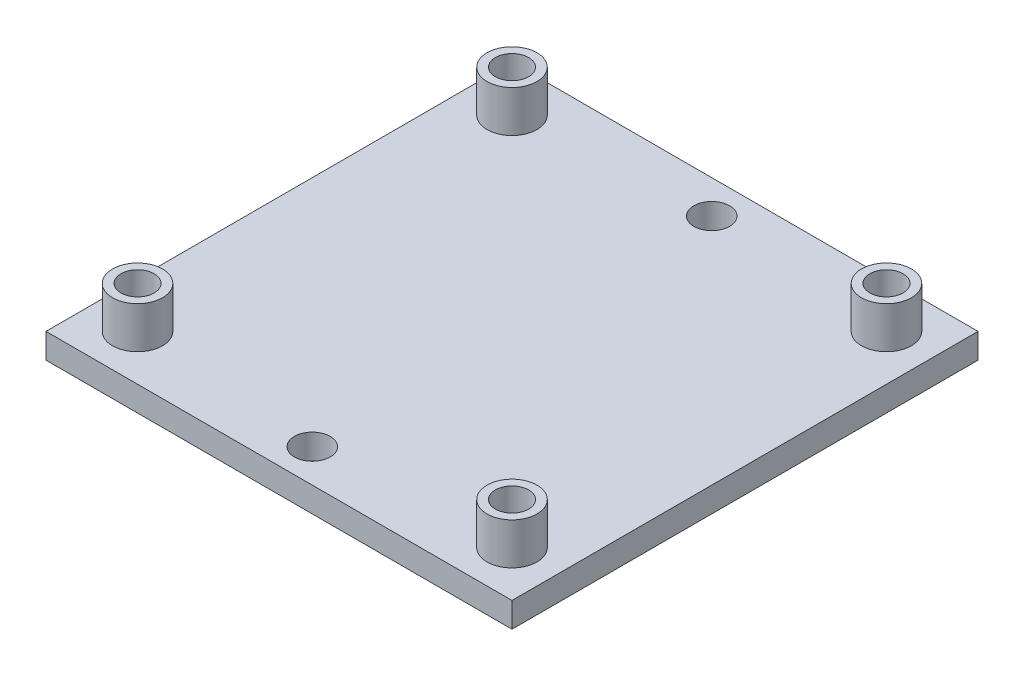
ISO-10303-21;
HEADER;
FILE_DESCRIPTION(('STEP AP214'),'2;1');
FILE_NAME('part.step','',(''),(''),'','','');
FILE_SCHEMA(('AUTOMOTIVE_DESIGN { 1 0 10303 214 1 1 1 1 }'));
ENDSEC;
DATA;
#1=APPLICATION_CONTEXT('core data for automotive mechanical design processes');
#2=APPLICATION_PROTOCOL_DEFINITION('international standard','automotive_design',2000,#1);
#3=PRODUCT_CONTEXT('',#1,'mechanical');
#4=PRODUCT('Part','Part','',(#3));
#5=PRODUCT_RELATED_PRODUCT_CATEGORY('part','',(#4));
#6=PRODUCT_DEFINITION_FORMATION('','',#4);
#7=PRODUCT_DEFINITION_CONTEXT('part definition',#1,'design');
#8=PRODUCT_DEFINITION('design','',#6,#7);
#9=PRODUCT_DEFINITION_SHAPE('','',#8);
#10=(LENGTH_UNIT() NAMED_UNIT(*) SI_UNIT(.MILLI.,.METRE.));
#11=(NAMED_UNIT(*) PLANE_ANGLE_UNIT() SI_UNIT($,.RADIAN.));
#12=(NAMED_UNIT(*) SI_UNIT($,.STERADIAN.) SOLID_ANGLE_UNIT());
#13=UNCERTAINTY_MEASURE_WITH_UNIT(LENGTH_MEASURE(1.E-05),#10,'distance_accuracy_value','');
#14=(GEOMETRIC_REPRESENTATION_CONTEXT(3) GLOBAL_UNCERTAINTY_ASSIGNED_CONTEXT((#13)) GLOBAL_UNIT_ASSIGNED_CONTEXT((#10,
#11,#12)) REPRESENTATION_CONTEXT('',''));
#15=CARTESIAN_POINT('',(0.,0.,0.));
#16=DIRECTION('',(0.,0.,1.));
#17=DIRECTION('',(1.,0.,0.));
#18=AXIS2_PLACEMENT_3D('',#15,#16,#17);
#19=CARTESIAN_POINT('',(-28.,3.,-28.));
#20=DIRECTION('',(1.,0.,0.));
#21=DIRECTION('',(0.,0.,-1.));
#22=AXIS2_PLACEMENT_3D('',#19,#20,#21);
#23=PLANE('',#22);
#24=DIRECTION('',(0.,0.,1.));
#25=VECTOR('',#24,1.);
#26=CARTESIAN_POINT('',(-28.,0.,-28.));
#27=LINE('',#26,#25);
#28=CARTESIAN_POINT('',(-28.,0.,-28.));
#29=VERTEX_POINT('',#28);
#30=CARTESIAN_POINT('',(-28.,0.,28.));
#31=VERTEX_POINT('',#30);
#32=EDGE_CURVE('E106',#29,#31,#27,.T.);
#33=ORIENTED_EDGE('',*,*,#32,.T.);
#34=DIRECTION('',(0.,-1.,0.));
#35=VECTOR('',#34,1.);
#36=CARTESIAN_POINT('',(-28.,3.,28.));
#37=LINE('',#36,#35);
#38=CARTESIAN_POINT('',(-28.,3.,28.));
#39=VERTEX_POINT('',#38);
#40=EDGE_CURVE('E45',#39,#31,#37,.T.);
#41=ORIENTED_EDGE('',*,*,#40,.F.);
#42=DIRECTION('',(0.,0.,1.));
#43=VECTOR('',#42,1.);
#44=CARTESIAN_POINT('',(-28.,3.,-28.));
#45=LINE('',#44,#43);
#46=CARTESIAN_POINT('',(-28.,3.,-28.));
#47=VERTEX_POINT('',#46);
#48=EDGE_CURVE('E91',#47,#39,#45,.T.);
#49=ORIENTED_EDGE('',*,*,#48,.F.);
#50=DIRECTION('',(0.,-1.,0.));
#51=VECTOR('',#50,1.);
#52=CARTESIAN_POINT('',(-28.,3.,-28.));
#53=LINE('',#52,#51);
#54=EDGE_CURVE('E105',#47,#29,#53,.T.);
#55=ORIENTED_EDGE('',*,*,#54,.T.);
#56=EDGE_LOOP('',(#33,#41,#49,#55));
#57=FACE_BOUND('',#56,.T.);
#58=ADVANCED_FACE('F39',(#57),#23,.F.);
#59=CARTESIAN_POINT('',(-28.,3.,28.));
#60=DIRECTION('',(0.,0.,-1.));
#61=DIRECTION('',(-1.,0.,0.));
#62=AXIS2_PLACEMENT_3D('',#59,#60,#61);
#63=PLANE('',#62);
#64=DIRECTION('',(1.,0.,0.));
#65=VECTOR('',#64,1.);
#66=CARTESIAN_POINT('',(-28.,0.,28.));
#67=LINE('',#66,#65);
#68=CARTESIAN_POINT('',(28.,0.,28.));
#69=VERTEX_POINT('',#68);
#70=EDGE_CURVE('E96',#31,#69,#67,.T.);
#71=ORIENTED_EDGE('',*,*,#70,.T.);
#72=DIRECTION('',(0.,-1.,0.));
#73=VECTOR('',#72,1.);
#74=CARTESIAN_POINT('',(28.,3.,28.));
#75=LINE('',#74,#73);
#76=CARTESIAN_POINT('',(28.,3.,28.));
#77=VERTEX_POINT('',#76);
#78=EDGE_CURVE('E98',#77,#69,#75,.T.);
#79=ORIENTED_EDGE('',*,*,#78,.F.);
#80=DIRECTION('',(1.,0.,0.));
#81=VECTOR('',#80,1.);
#82=CARTESIAN_POINT('',(-28.,3.,28.));
#83=LINE('',#82,#81);
#84=EDGE_CURVE('E87',#39,#77,#83,.T.);
#85=ORIENTED_EDGE('',*,*,#84,.F.);
#86=ORIENTED_EDGE('',*,*,#40,.T.);
#87=EDGE_LOOP('',(#71,#79,#85,#86));
#88=FACE_BOUND('',#87,.T.);
#89=ADVANCED_FACE('F97',(#88),#63,.F.);
#90=CARTESIAN_POINT('',(28.,3.,-28.));
#91=DIRECTION('',(-1.,0.,0.));
#92=DIRECTION('',(0.,0.,1.));
#93=AXIS2_PLACEMENT_3D('',#90,#91,#92);
#94=PLANE('',#93);
#95=DIRECTION('',(0.,0.,-1.));
#96=VECTOR('',#95,1.);
#97=CARTESIAN_POINT('',(28.,0.,-28.));
#98=LINE('',#97,#96);
#99=CARTESIAN_POINT('',(28.,0.,-28.));
#100=VERTEX_POINT('',#99);
#101=EDGE_CURVE('E74',#69,#100,#98,.T.);
#102=ORIENTED_EDGE('',*,*,#101,.T.);
#103=DIRECTION('',(0.,-1.,0.));
#104=VECTOR('',#103,1.);
#105=CARTESIAN_POINT('',(28.,3.,-28.));
#106=LINE('',#105,#104);
#107=CARTESIAN_POINT('',(28.,3.,-28.));
#108=VERTEX_POINT('',#107);
#109=EDGE_CURVE('E100',#108,#100,#106,.T.);
#110=ORIENTED_EDGE('',*,*,#109,.F.);
#111=DIRECTION('',(0.,0.,-1.));
#112=VECTOR('',#111,1.);
#113=CARTESIAN_POINT('',(28.,3.,-28.));
#114=LINE('',#113,#112);
#115=EDGE_CURVE('E93',#77,#108,#114,.T.);
#116=ORIENTED_EDGE('',*,*,#115,.F.);
#117=ORIENTED_EDGE('',*,*,#78,.T.);
#118=EDGE_LOOP('',(#102,#110,#116,#117));
#119=FACE_BOUND('',#118,.T.);
#120=ADVANCED_FACE('F99',(#119),#94,.F.);
#121=CARTESIAN_POINT('',(-28.,3.,-28.));
#122=DIRECTION('',(0.,0.,1.));
#123=DIRECTION('',(1.,0.,0.));
#124=AXIS2_PLACEMENT_3D('',#121,#122,#123);
#125=PLANE('',#124);
#126=DIRECTION('',(-1.,0.,0.));
#127=VECTOR('',#126,1.);
#128=CARTESIAN_POINT('',(-28.,0.,-28.));
#129=LINE('',#128,#127);
#130=EDGE_CURVE('E78',#100,#29,#129,.T.);
#131=ORIENTED_EDGE('',*,*,#130,.T.);
#132=ORIENTED_EDGE('',*,*,#54,.F.);
#133=DIRECTION('',(-1.,0.,0.));
#134=VECTOR('',#133,1.);
#135=CARTESIAN_POINT('',(-28.,3.,-28.));
#136=LINE('',#135,#134);
#137=EDGE_CURVE('E60',#108,#47,#136,.T.);
#138=ORIENTED_EDGE('',*,*,#137,.F.);
#139=ORIENTED_EDGE('',*,*,#109,.T.);
#140=EDGE_LOOP('',(#131,#132,#138,#139));
#141=FACE_BOUND('',#140,.T.);
#142=ADVANCED_FACE('F112',(#141),#125,.F.);
#143=CARTESIAN_POINT('',(0.,3.,0.));
#144=DIRECTION('',(0.,1.,0.));
#145=DIRECTION('',(0.,0.,1.));
#146=AXIS2_PLACEMENT_3D('',#143,#144,#145);
#147=PLANE('',#146);
#148=CARTESIAN_POINT('',(0.,3.,24.));
#149=DIRECTION('',(0.,1.,0.));
#150=DIRECTION('',(0.,0.,1.));
#151=AXIS2_PLACEMENT_3D('',#148,#149,#150);
#152=CIRCLE('',#151,2.15);
#153=CARTESIAN_POINT('',(0.,3.,26.15));
#154=VERTEX_POINT('',#153);
#155=EDGE_CURVE('E163',#154,#154,#152,.T.);
#156=ORIENTED_EDGE('',*,*,#155,.F.);
#157=EDGE_LOOP('',(#156));
#158=FACE_BOUND('',#157,.T.);
#159=CARTESIAN_POINT('',(0.,3.,-24.));
#160=DIRECTION('',(0.,1.,0.));
#161=DIRECTION('',(0.,0.,1.));
#162=AXIS2_PLACEMENT_3D('',#159,#160,#161);
#163=CIRCLE('',#162,2.15);
#164=CARTESIAN_POINT('',(0.,3.,-21.85));
#165=VERTEX_POINT('',#164);
#166=EDGE_CURVE('E165',#165,#165,#163,.T.);
#167=ORIENTED_EDGE('',*,*,#166,.F.);
#168=EDGE_LOOP('',(#167));
#169=FACE_BOUND('',#168,.T.);
#170=CARTESIAN_POINT('',(-22.5,3.,22.5));
#171=DIRECTION('',(0.,1.,0.));
#172=DIRECTION('',(0.,0.,1.));
#173=AXIS2_PLACEMENT_3D('',#170,#171,#172);
#174=CIRCLE('',#173,3.);
#175=CARTESIAN_POINT('',(-22.5,3.,25.5));
#176=VERTEX_POINT('',#175);
#177=EDGE_CURVE('E11',#176,#176,#174,.T.);
#178=ORIENTED_EDGE('',*,*,#177,.F.);
#179=EDGE_LOOP('',(#178));
#180=FACE_BOUND('',#179,.T.);
#181=CARTESIAN_POINT('',(22.5,3.,-22.5));
#182=DIRECTION('',(0.,1.,0.));
#183=DIRECTION('',(0.,0.,1.));
#184=AXIS2_PLACEMENT_3D('',#181,#182,#183);
#185=CIRCLE('',#184,3.);
#186=CARTESIAN_POINT('',(22.5,3.,-19.5));
#187=VERTEX_POINT('',#186);
#188=EDGE_CURVE('E48',#187,#187,#185,.T.);
#189=ORIENTED_EDGE('',*,*,#188,.F.);
#190=EDGE_LOOP('',(#189));
#191=FACE_BOUND('',#190,.T.);
#192=CARTESIAN_POINT('',(-22.5,3.,-22.5));
#193=DIRECTION('',(0.,1.,0.));
#194=DIRECTION('',(0.,0.,1.));
#195=AXIS2_PLACEMENT_3D('',#192,#193,#194);
#196=CIRCLE('',#195,3.);
#197=CARTESIAN_POINT('',(-22.5,3.,-19.5));
#198=VERTEX_POINT('',#197);
#199=EDGE_CURVE('E124',#198,#198,#196,.T.);
#200=ORIENTED_EDGE('',*,*,#199,.F.);
#201=EDGE_LOOP('',(#200));
#202=FACE_BOUND('',#201,.T.);
#203=CARTESIAN_POINT('',(22.5,3.,22.5));
#204=DIRECTION('',(0.,1.,0.));
#205=DIRECTION('',(0.,0.,1.));
#206=AXIS2_PLACEMENT_3D('',#203,#204,#205);
#207=CIRCLE('',#206,3.);
#208=CARTESIAN_POINT('',(22.5,3.,25.5));
#209=VERTEX_POINT('',#208);
#210=EDGE_CURVE('E119',#209,#209,#207,.T.);
#211=ORIENTED_EDGE('',*,*,#210,.F.);
#212=EDGE_LOOP('',(#211));
#213=FACE_BOUND('',#212,.T.);
#214=ORIENTED_EDGE('',*,*,#48,.T.);
#215=ORIENTED_EDGE('',*,*,#84,.T.);
#216=ORIENTED_EDGE('',*,*,#115,.T.);
#217=ORIENTED_EDGE('',*,*,#137,.T.);
#218=EDGE_LOOP('',(#214,#215,#216,#217));
#219=FACE_BOUND('',#218,.T.);
#220=ADVANCED_FACE('F88',(#158,#169,#180,#191,#202,#213,#219),#147,.T.);
#221=CARTESIAN_POINT('',(0.,0.,0.));
#222=DIRECTION('',(0.,1.,0.));
#223=DIRECTION('',(0.,0.,1.));
#224=AXIS2_PLACEMENT_3D('',#221,#222,#223);
#225=PLANE('',#224);
#226=CARTESIAN_POINT('',(0.,0.,24.));
#227=DIRECTION('',(0.,1.,0.));
#228=DIRECTION('',(0.,0.,1.));
#229=AXIS2_PLACEMENT_3D('',#226,#227,#228);
#230=CIRCLE('',#229,2.15);
#231=CARTESIAN_POINT('',(0.,0.,26.15));
#232=VERTEX_POINT('',#231);
#233=EDGE_CURVE('E167',#232,#232,#230,.T.);
#234=ORIENTED_EDGE('',*,*,#233,.T.);
#235=EDGE_LOOP('',(#234));
#236=FACE_BOUND('',#235,.T.);
#237=CARTESIAN_POINT('',(0.,0.,-24.));
#238=DIRECTION('',(0.,1.,0.));
#239=DIRECTION('',(0.,0.,1.));
#240=AXIS2_PLACEMENT_3D('',#237,#238,#239);
#241=CIRCLE('',#240,2.15);
#242=CARTESIAN_POINT('',(0.,0.,-21.85));
#243=VERTEX_POINT('',#242);
#244=EDGE_CURVE('E170',#243,#243,#241,.T.);
#245=ORIENTED_EDGE('',*,*,#244,.T.);
#246=EDGE_LOOP('',(#245));
#247=FACE_BOUND('',#246,.T.);
#248=ORIENTED_EDGE('',*,*,#32,.F.);
#249=ORIENTED_EDGE('',*,*,#130,.F.);
#250=ORIENTED_EDGE('',*,*,#101,.F.);
#251=ORIENTED_EDGE('',*,*,#70,.F.);
#252=EDGE_LOOP('',(#248,#249,#250,#251));
#253=FACE_BOUND('',#252,.T.);
#254=ADVANCED_FACE('F120',(#236,#247,#253),#225,.F.);
#255=CARTESIAN_POINT('',(22.5,8.,22.5));
#256=DIRECTION('',(0.,-1.,0.));
#257=DIRECTION('',(0.,0.,-1.));
#258=AXIS2_PLACEMENT_3D('',#255,#256,#257);
#259=CYLINDRICAL_SURFACE('',#258,3.);
#260=CARTESIAN_POINT('',(22.5,8.,22.5));
#261=DIRECTION('',(0.,1.,0.));
#262=DIRECTION('',(0.,0.,1.));
#263=AXIS2_PLACEMENT_3D('',#260,#261,#262);
#264=CIRCLE('',#263,3.);
#265=CARTESIAN_POINT('',(22.5,8.,25.5));
#266=VERTEX_POINT('',#265);
#267=EDGE_CURVE('E107',#266,#266,#264,.T.);
#268=ORIENTED_EDGE('',*,*,#267,.F.);
#269=EDGE_LOOP('',(#268));
#270=FACE_BOUND('',#269,.T.);
#271=ORIENTED_EDGE('',*,*,#210,.T.);
#272=EDGE_LOOP('',(#271));
#273=FACE_BOUND('',#272,.T.);
#274=ADVANCED_FACE('F195',(#270,#273),#259,.T.);
#275=CARTESIAN_POINT('',(22.5,8.,22.5));
#276=DIRECTION('',(0.,1.,0.));
#277=DIRECTION('',(0.,0.,1.));
#278=AXIS2_PLACEMENT_3D('',#275,#276,#277);
#279=PLANE('',#278);
#280=CARTESIAN_POINT('',(22.5,8.,22.5));
#281=DIRECTION('',(0.,1.,0.));
#282=DIRECTION('',(0.,0.,1.));
#283=AXIS2_PLACEMENT_3D('',#280,#281,#282);
#284=CIRCLE('',#283,2.);
#285=CARTESIAN_POINT('',(22.5,8.,24.5));
#286=VERTEX_POINT('',#285);
#287=EDGE_CURVE('E137',#286,#286,#284,.T.);
#288=ORIENTED_EDGE('',*,*,#287,.F.);
#289=EDGE_LOOP('',(#288));
#290=FACE_BOUND('',#289,.T.);
#291=ORIENTED_EDGE('',*,*,#267,.T.);
#292=EDGE_LOOP('',(#291));
#293=FACE_BOUND('',#292,.T.);
#294=ADVANCED_FACE('F191',(#290,#293),#279,.T.);
#295=CARTESIAN_POINT('',(-22.5,8.,-22.5));
#296=DIRECTION('',(0.,-1.,0.));
#297=DIRECTION('',(0.,0.,-1.));
#298=AXIS2_PLACEMENT_3D('',#295,#296,#297);
#299=CYLINDRICAL_SURFACE('',#298,3.);
#300=CARTESIAN_POINT('',(-22.5,8.,-22.5));
#301=DIRECTION('',(0.,1.,0.));
#302=DIRECTION('',(0.,0.,1.));
#303=AXIS2_PLACEMENT_3D('',#300,#301,#302);
#304=CIRCLE('',#303,3.);
#305=CARTESIAN_POINT('',(-22.5,8.,-19.5));
#306=VERTEX_POINT('',#305);
#307=EDGE_CURVE('E128',#306,#306,#304,.T.);
#308=ORIENTED_EDGE('',*,*,#307,.F.);
#309=EDGE_LOOP('',(#308));
#310=FACE_BOUND('',#309,.T.);
#311=ORIENTED_EDGE('',*,*,#199,.T.);
#312=EDGE_LOOP('',(#311));
#313=FACE_BOUND('',#312,.T.);
#314=ADVANCED_FACE('F205',(#310,#313),#299,.T.);
#315=CARTESIAN_POINT('',(-22.5,8.,-22.5));
#316=DIRECTION('',(0.,1.,0.));
#317=DIRECTION('',(0.,0.,1.));
#318=AXIS2_PLACEMENT_3D('',#315,#316,#317);
#319=PLANE('',#318);
#320=CARTESIAN_POINT('',(-22.5,8.,-22.5));
#321=DIRECTION('',(0.,1.,0.));
#322=DIRECTION('',(0.,0.,1.));
#323=AXIS2_PLACEMENT_3D('',#320,#321,#322);
#324=CIRCLE('',#323,2.);
#325=CARTESIAN_POINT('',(-22.5,8.,-20.5));
#326=VERTEX_POINT('',#325);
#327=EDGE_CURVE('E148',#326,#326,#324,.T.);
#328=ORIENTED_EDGE('',*,*,#327,.F.);
#329=EDGE_LOOP('',(#328));
#330=FACE_BOUND('',#329,.T.);
#331=ORIENTED_EDGE('',*,*,#307,.T.);
#332=EDGE_LOOP('',(#331));
#333=FACE_BOUND('',#332,.T.);
#334=ADVANCED_FACE('F261',(#330,#333),#319,.T.);
#335=CARTESIAN_POINT('',(22.5,8.,-22.5));
#336=DIRECTION('',(0.,-1.,0.));
#337=DIRECTION('',(0.,0.,-1.));
#338=AXIS2_PLACEMENT_3D('',#335,#336,#337);
#339=CYLINDRICAL_SURFACE('',#338,3.);
#340=CARTESIAN_POINT('',(22.5,8.,-22.5));
#341=DIRECTION('',(0.,1.,0.));
#342=DIRECTION('',(0.,0.,1.));
#343=AXIS2_PLACEMENT_3D('',#340,#341,#342);
#344=CIRCLE('',#343,3.);
#345=CARTESIAN_POINT('',(22.5,8.,-19.5));
#346=VERTEX_POINT('',#345);
#347=EDGE_CURVE('E130',#346,#346,#344,.T.);
#348=ORIENTED_EDGE('',*,*,#347,.F.);
#349=EDGE_LOOP('',(#348));
#350=FACE_BOUND('',#349,.T.);
#351=ORIENTED_EDGE('',*,*,#188,.T.);
#352=EDGE_LOOP('',(#351));
#353=FACE_BOUND('',#352,.T.);
#354=ADVANCED_FACE('F267',(#350,#353),#339,.T.);
#355=CARTESIAN_POINT('',(22.5,8.,-22.5));
#356=DIRECTION('',(0.,1.,0.));
#357=DIRECTION('',(0.,0.,1.));
#358=AXIS2_PLACEMENT_3D('',#355,#356,#357);
#359=PLANE('',#358);
#360=CARTESIAN_POINT('',(22.5,8.,-22.5));
#361=DIRECTION('',(0.,1.,0.));
#362=DIRECTION('',(0.,0.,1.));
#363=AXIS2_PLACEMENT_3D('',#360,#361,#362);
#364=CIRCLE('',#363,2.);
#365=CARTESIAN_POINT('',(22.5,8.,-20.5));
#366=VERTEX_POINT('',#365);
#367=EDGE_CURVE('E146',#366,#366,#364,.T.);
#368=ORIENTED_EDGE('',*,*,#367,.F.);
#369=EDGE_LOOP('',(#368));
#370=FACE_BOUND('',#369,.T.);
#371=ORIENTED_EDGE('',*,*,#347,.T.);
#372=EDGE_LOOP('',(#371));
#373=FACE_BOUND('',#372,.T.);
#374=ADVANCED_FACE('F276',(#370,#373),#359,.T.);
#375=CARTESIAN_POINT('',(-22.5,8.,22.5));
#376=DIRECTION('',(0.,-1.,0.));
#377=DIRECTION('',(0.,0.,-1.));
#378=AXIS2_PLACEMENT_3D('',#375,#376,#377);
#379=CYLINDRICAL_SURFACE('',#378,3.);
#380=CARTESIAN_POINT('',(-22.5,8.,22.5));
#381=DIRECTION('',(0.,1.,0.));
#382=DIRECTION('',(0.,0.,1.));
#383=AXIS2_PLACEMENT_3D('',#380,#381,#382);
#384=CIRCLE('',#383,3.);
#385=CARTESIAN_POINT('',(-22.5,8.,25.5));
#386=VERTEX_POINT('',#385);
#387=EDGE_CURVE('E127',#386,#386,#384,.T.);
#388=ORIENTED_EDGE('',*,*,#387,.F.);
#389=EDGE_LOOP('',(#388));
#390=FACE_BOUND('',#389,.T.);
#391=ORIENTED_EDGE('',*,*,#177,.T.);
#392=EDGE_LOOP('',(#391));
#393=FACE_BOUND('',#392,.T.);
#394=ADVANCED_FACE('F286',(#390,#393),#379,.T.);
#395=CARTESIAN_POINT('',(-22.5,8.,22.5));
#396=DIRECTION('',(0.,1.,0.));
#397=DIRECTION('',(0.,0.,1.));
#398=AXIS2_PLACEMENT_3D('',#395,#396,#397);
#399=PLANE('',#398);
#400=CARTESIAN_POINT('',(-22.5,8.,22.5));
#401=DIRECTION('',(0.,1.,0.));
#402=DIRECTION('',(0.,0.,1.));
#403=AXIS2_PLACEMENT_3D('',#400,#401,#402);
#404=CIRCLE('',#403,2.);
#405=CARTESIAN_POINT('',(-22.5,8.,24.5));
#406=VERTEX_POINT('',#405);
#407=EDGE_CURVE('E141',#406,#406,#404,.T.);
#408=ORIENTED_EDGE('',*,*,#407,.F.);
#409=EDGE_LOOP('',(#408));
#410=FACE_BOUND('',#409,.T.);
#411=ORIENTED_EDGE('',*,*,#387,.T.);
#412=EDGE_LOOP('',(#411));
#413=FACE_BOUND('',#412,.T.);
#414=ADVANCED_FACE('F300',(#410,#413),#399,.T.);
#415=CARTESIAN_POINT('',(-22.5,2.3,22.5));
#416=DIRECTION('',(0.,1.,0.));
#417=DIRECTION('',(0.,0.,1.));
#418=AXIS2_PLACEMENT_3D('',#415,#416,#417);
#419=CYLINDRICAL_SURFACE('',#418,2.);
#420=CARTESIAN_POINT('',(-22.5,2.3,22.5));
#421=DIRECTION('',(0.,1.,0.));
#422=DIRECTION('',(0.,0.,1.));
#423=AXIS2_PLACEMENT_3D('',#420,#421,#422);
#424=CIRCLE('',#423,2.);
#425=CARTESIAN_POINT('',(-22.5,2.3,24.5));
#426=VERTEX_POINT('',#425);
#427=EDGE_CURVE('E152',#426,#426,#424,.T.);
#428=ORIENTED_EDGE('',*,*,#427,.F.);
#429=EDGE_LOOP('',(#428));
#430=FACE_BOUND('',#429,.T.);
#431=ORIENTED_EDGE('',*,*,#407,.T.);
#432=EDGE_LOOP('',(#431));
#433=FACE_BOUND('',#432,.T.);
#434=ADVANCED_FACE('F306',(#430,#433),#419,.F.);
#435=CARTESIAN_POINT('',(-22.5,2.3,22.5));
#436=DIRECTION('',(0.,1.,0.));
#437=DIRECTION('',(0.,0.,1.));
#438=AXIS2_PLACEMENT_3D('',#435,#436,#437);
#439=PLANE('',#438);
#440=ORIENTED_EDGE('',*,*,#427,.T.);
#441=EDGE_LOOP('',(#440));
#442=FACE_BOUND('',#441,.T.);
#443=ADVANCED_FACE('F314',(#442),#439,.T.);
#444=CARTESIAN_POINT('',(22.5,2.3,-22.5));
#445=DIRECTION('',(0.,1.,0.));
#446=DIRECTION('',(0.,0.,1.));
#447=AXIS2_PLACEMENT_3D('',#444,#445,#446);
#448=CYLINDRICAL_SURFACE('',#447,2.);
#449=CARTESIAN_POINT('',(22.5,2.3,-22.5));
#450=DIRECTION('',(0.,1.,0.));
#451=DIRECTION('',(0.,0.,1.));
#452=AXIS2_PLACEMENT_3D('',#449,#450,#451);
#453=CIRCLE('',#452,2.);
#454=CARTESIAN_POINT('',(22.5,2.3,-20.5));
#455=VERTEX_POINT('',#454);
#456=EDGE_CURVE('E147',#455,#455,#453,.T.);
#457=ORIENTED_EDGE('',*,*,#456,.F.);
#458=EDGE_LOOP('',(#457));
#459=FACE_BOUND('',#458,.T.);
#460=ORIENTED_EDGE('',*,*,#367,.T.);
#461=EDGE_LOOP('',(#460));
#462=FACE_BOUND('',#461,.T.);
#463=ADVANCED_FACE('F321',(#459,#462),#448,.F.);
#464=CARTESIAN_POINT('',(22.5,2.3,-22.5));
#465=DIRECTION('',(0.,1.,0.));
#466=DIRECTION('',(0.,0.,1.));
#467=AXIS2_PLACEMENT_3D('',#464,#465,#466);
#468=PLANE('',#467);
#469=ORIENTED_EDGE('',*,*,#456,.T.);
#470=EDGE_LOOP('',(#469));
#471=FACE_BOUND('',#470,.T.);
#472=ADVANCED_FACE('F331',(#471),#468,.T.);
#473=CARTESIAN_POINT('',(-22.5,2.3,-22.5));
#474=DIRECTION('',(0.,1.,0.));
#475=DIRECTION('',(0.,0.,1.));
#476=AXIS2_PLACEMENT_3D('',#473,#474,#475);
#477=CYLINDRICAL_SURFACE('',#476,2.);
#478=CARTESIAN_POINT('',(-22.5,2.3,-22.5));
#479=DIRECTION('',(0.,1.,0.));
#480=DIRECTION('',(0.,0.,1.));
#481=AXIS2_PLACEMENT_3D('',#478,#479,#480);
#482=CIRCLE('',#481,2.);
#483=CARTESIAN_POINT('',(-22.5,2.3,-20.5));
#484=VERTEX_POINT('',#483);
#485=EDGE_CURVE('E156',#484,#484,#482,.T.);
#486=ORIENTED_EDGE('',*,*,#485,.F.);
#487=EDGE_LOOP('',(#486));
#488=FACE_BOUND('',#487,.T.);
#489=ORIENTED_EDGE('',*,*,#327,.T.);
#490=EDGE_LOOP('',(#489));
#491=FACE_BOUND('',#490,.T.);
#492=ADVANCED_FACE('F345',(#488,#491),#477,.F.);
#493=CARTESIAN_POINT('',(-22.5,2.3,-22.5));
#494=DIRECTION('',(0.,1.,0.));
#495=DIRECTION('',(0.,0.,1.));
#496=AXIS2_PLACEMENT_3D('',#493,#494,#495);
#497=PLANE('',#496);
#498=ORIENTED_EDGE('',*,*,#485,.T.);
#499=EDGE_LOOP('',(#498));
#500=FACE_BOUND('',#499,.T.);
#501=ADVANCED_FACE('F353',(#500),#497,.T.);
#502=CARTESIAN_POINT('',(22.5,2.3,22.5));
#503=DIRECTION('',(0.,1.,0.));
#504=DIRECTION('',(0.,0.,1.));
#505=AXIS2_PLACEMENT_3D('',#502,#503,#504);
#506=CYLINDRICAL_SURFACE('',#505,2.);
#507=CARTESIAN_POINT('',(22.5,2.3,22.5));
#508=DIRECTION('',(0.,1.,0.));
#509=DIRECTION('',(0.,0.,1.));
#510=AXIS2_PLACEMENT_3D('',#507,#508,#509);
#511=CIRCLE('',#510,2.);
#512=CARTESIAN_POINT('',(22.5,2.3,24.5));
#513=VERTEX_POINT('',#512);
#514=EDGE_CURVE('E140',#513,#513,#511,.T.);
#515=ORIENTED_EDGE('',*,*,#514,.F.);
#516=EDGE_LOOP('',(#515));
#517=FACE_BOUND('',#516,.T.);
#518=ORIENTED_EDGE('',*,*,#287,.T.);
#519=EDGE_LOOP('',(#518));
#520=FACE_BOUND('',#519,.T.);
#521=ADVANCED_FACE('F359',(#517,#520),#506,.F.);
#522=CARTESIAN_POINT('',(22.5,2.3,22.5));
#523=DIRECTION('',(0.,1.,0.));
#524=DIRECTION('',(0.,0.,1.));
#525=AXIS2_PLACEMENT_3D('',#522,#523,#524);
#526=PLANE('',#525);
#527=ORIENTED_EDGE('',*,*,#514,.T.);
#528=EDGE_LOOP('',(#527));
#529=FACE_BOUND('',#528,.T.);
#530=ADVANCED_FACE('F367',(#529),#526,.T.);
#531=CARTESIAN_POINT('',(0.,3.,-24.));
#532=DIRECTION('',(0.,-1.,0.));
#533=DIRECTION('',(0.,0.,-1.));
#534=AXIS2_PLACEMENT_3D('',#531,#532,#533);
#535=CYLINDRICAL_SURFACE('',#534,2.15);
#536=ORIENTED_EDGE('',*,*,#166,.T.);
#537=EDGE_LOOP('',(#536));
#538=FACE_BOUND('',#537,.T.);
#539=ORIENTED_EDGE('',*,*,#244,.F.);
#540=EDGE_LOOP('',(#539));
#541=FACE_BOUND('',#540,.T.);
#542=ADVANCED_FACE('F377',(#538,#541),#535,.F.);
#543=CARTESIAN_POINT('',(0.,3.,24.));
#544=DIRECTION('',(0.,-1.,0.));
#545=DIRECTION('',(0.,0.,-1.));
#546=AXIS2_PLACEMENT_3D('',#543,#544,#545);
#547=CYLINDRICAL_SURFACE('',#546,2.15);
#548=ORIENTED_EDGE('',*,*,#155,.T.);
#549=EDGE_LOOP('',(#548));
#550=FACE_BOUND('',#549,.T.);
#551=ORIENTED_EDGE('',*,*,#233,.F.);
#552=EDGE_LOOP('',(#551));
#553=FACE_BOUND('',#552,.T.);
#554=ADVANCED_FACE('F176',(#550,#553),#547,.F.);
#555=CLOSED_SHELL('',(#58,#89,#120,#142,#220,#254,#274,#294,#314,#334,#354,#374,#394,#414,#434,
#443,#463,#472,#492,#501,#521,#530,#542,#554));
#556=MANIFOLD_SOLID_BREP('B2',#555);
#557=ADVANCED_BREP_SHAPE_REPRESENTATION('',(#18,#556),#14);
#558=SHAPE_DEFINITION_REPRESENTATION(#9,#557);
ENDSEC;
END-ISO-10303-21;
